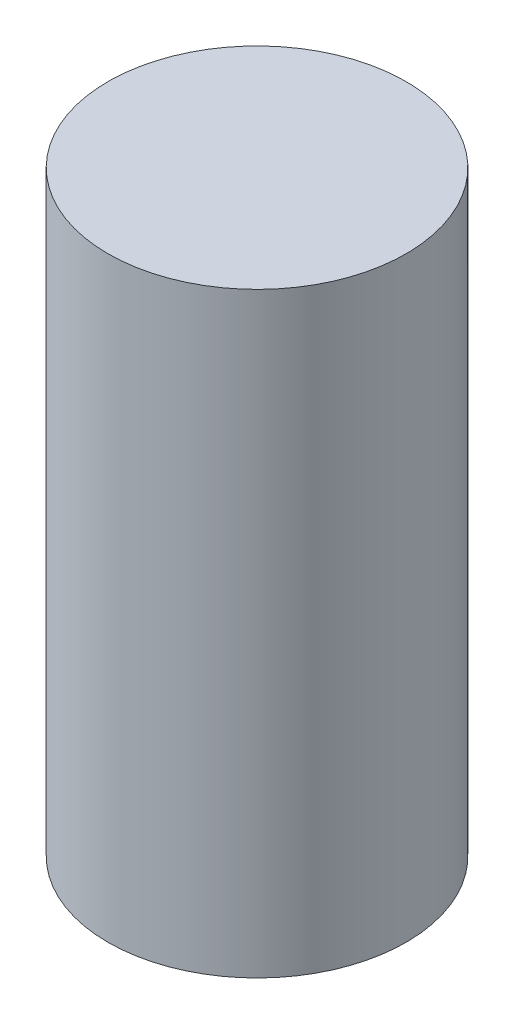
ISO-10303-21;
HEADER;
FILE_DESCRIPTION(('STEP AP214'),'2;1');
FILE_NAME('part.step','',(''),(''),'','','');
FILE_SCHEMA(('AUTOMOTIVE_DESIGN { 1 0 10303 214 1 1 1 1 }'));
ENDSEC;
DATA;
#1=APPLICATION_CONTEXT('core data for automotive mechanical design processes');
#2=APPLICATION_PROTOCOL_DEFINITION('international standard','automotive_design',2000,#1);
#3=PRODUCT_CONTEXT('',#1,'mechanical');
#4=PRODUCT('Part','Part','',(#3));
#5=PRODUCT_RELATED_PRODUCT_CATEGORY('part','',(#4));
#6=PRODUCT_DEFINITION_FORMATION('','',#4);
#7=PRODUCT_DEFINITION_CONTEXT('part definition',#1,'design');
#8=PRODUCT_DEFINITION('design','',#6,#7);
#9=PRODUCT_DEFINITION_SHAPE('','',#8);
#10=(LENGTH_UNIT() NAMED_UNIT(*) SI_UNIT(.MILLI.,.METRE.));
#11=(NAMED_UNIT(*) PLANE_ANGLE_UNIT() SI_UNIT($,.RADIAN.));
#12=(NAMED_UNIT(*) SI_UNIT($,.STERADIAN.) SOLID_ANGLE_UNIT());
#13=UNCERTAINTY_MEASURE_WITH_UNIT(LENGTH_MEASURE(1.E-05),#10,'distance_accuracy_value','');
#14=(GEOMETRIC_REPRESENTATION_CONTEXT(3) GLOBAL_UNCERTAINTY_ASSIGNED_CONTEXT((#13)) GLOBAL_UNIT_ASSIGNED_CONTEXT((#10,
#11,#12)) REPRESENTATION_CONTEXT('',''));
#15=CARTESIAN_POINT('',(0.,0.,0.));
#16=DIRECTION('',(0.,0.,1.));
#17=DIRECTION('',(1.,0.,0.));
#18=AXIS2_PLACEMENT_3D('',#15,#16,#17);
#19=CARTESIAN_POINT('',(0.,14.,0.));
#20=DIRECTION('',(0.,-1.,0.));
#21=DIRECTION('',(0.,0.,-1.));
#22=AXIS2_PLACEMENT_3D('',#19,#20,#21);
#23=CYLINDRICAL_SURFACE('',#22,3.5);
#24=CARTESIAN_POINT('',(0.,14.,0.));
#25=DIRECTION('',(0.,1.,0.));
#26=DIRECTION('',(0.,0.,1.));
#27=AXIS2_PLACEMENT_3D('',#24,#25,#26);
#28=CIRCLE('',#27,3.5);
#29=CARTESIAN_POINT('',(0.,14.,3.5));
#30=VERTEX_POINT('',#29);
#31=EDGE_CURVE('E10',#30,#30,#28,.T.);
#32=ORIENTED_EDGE('',*,*,#31,.F.);
#33=EDGE_LOOP('',(#32));
#34=FACE_BOUND('',#33,.T.);
#35=CARTESIAN_POINT('',(0.,0.,0.));
#36=DIRECTION('',(0.,1.,0.));
#37=DIRECTION('',(0.,0.,1.));
#38=AXIS2_PLACEMENT_3D('',#35,#36,#37);
#39=CIRCLE('',#38,3.5);
#40=CARTESIAN_POINT('',(0.,0.,3.5));
#41=VERTEX_POINT('',#40);
#42=EDGE_CURVE('E34',#41,#41,#39,.T.);
#43=ORIENTED_EDGE('',*,*,#42,.T.);
#44=EDGE_LOOP('',(#43));
#45=FACE_BOUND('',#44,.T.);
#46=ADVANCED_FACE('F31',(#34,#45),#23,.T.);
#47=CARTESIAN_POINT('',(0.,14.,0.));
#48=DIRECTION('',(0.,1.,0.));
#49=DIRECTION('',(0.,0.,1.));
#50=AXIS2_PLACEMENT_3D('',#47,#48,#49);
#51=PLANE('',#50);
#52=ORIENTED_EDGE('',*,*,#31,.T.);
#53=EDGE_LOOP('',(#52));
#54=FACE_BOUND('',#53,.T.);
#55=ADVANCED_FACE('F46',(#54),#51,.T.);
#56=CARTESIAN_POINT('',(0.,0.,0.));
#57=DIRECTION('',(0.,1.,0.));
#58=DIRECTION('',(0.,0.,1.));
#59=AXIS2_PLACEMENT_3D('',#56,#57,#58);
#60=PLANE('',#59);
#61=ORIENTED_EDGE('',*,*,#42,.F.);
#62=EDGE_LOOP('',(#61));
#63=FACE_BOUND('',#62,.T.);
#64=ADVANCED_FACE('F44',(#63),#60,.F.);
#65=CLOSED_SHELL('',(#46,#55,#64));
#66=MANIFOLD_SOLID_BREP('B2',#65);
#67=ADVANCED_BREP_SHAPE_REPRESENTATION('',(#18,#66),#14);
#68=SHAPE_DEFINITION_REPRESENTATION(#9,#67);
ENDSEC;
END-ISO-10303-21;
